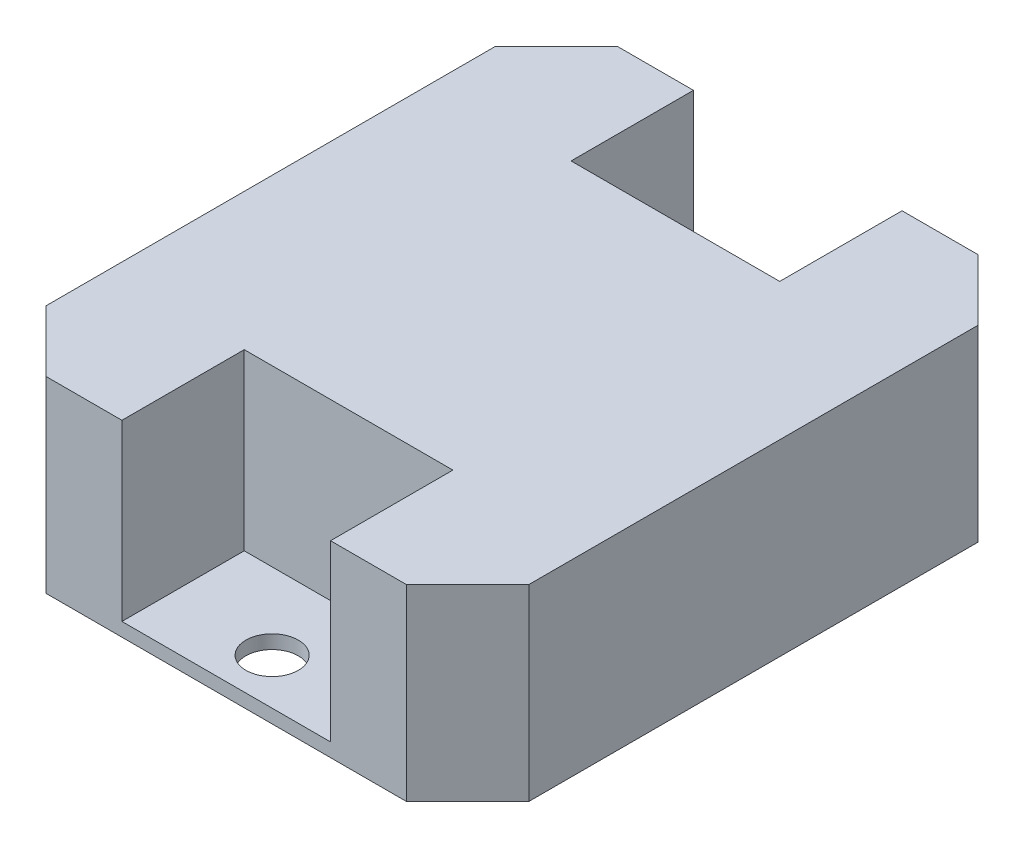
ISO-10303-21;
HEADER;
FILE_DESCRIPTION(('STEP AP214'),'2;1');
FILE_NAME('part.step','',(''),(''),'','','');
FILE_SCHEMA(('AUTOMOTIVE_DESIGN { 1 0 10303 214 1 1 1 1 }'));
ENDSEC;
DATA;
#1=APPLICATION_CONTEXT('core data for automotive mechanical design processes');
#2=APPLICATION_PROTOCOL_DEFINITION('international standard','automotive_design',2000,#1);
#3=PRODUCT_CONTEXT('',#1,'mechanical');
#4=PRODUCT('Part','Part','',(#3));
#5=PRODUCT_RELATED_PRODUCT_CATEGORY('part','',(#4));
#6=PRODUCT_DEFINITION_FORMATION('','',#4);
#7=PRODUCT_DEFINITION_CONTEXT('part definition',#1,'design');
#8=PRODUCT_DEFINITION('design','',#6,#7);
#9=PRODUCT_DEFINITION_SHAPE('','',#8);
#10=(LENGTH_UNIT() NAMED_UNIT(*) SI_UNIT(.MILLI.,.METRE.));
#11=(NAMED_UNIT(*) PLANE_ANGLE_UNIT() SI_UNIT($,.RADIAN.));
#12=(NAMED_UNIT(*) SI_UNIT($,.STERADIAN.) SOLID_ANGLE_UNIT());
#13=UNCERTAINTY_MEASURE_WITH_UNIT(LENGTH_MEASURE(1.E-05),#10,'distance_accuracy_value','');
#14=(GEOMETRIC_REPRESENTATION_CONTEXT(3) GLOBAL_UNCERTAINTY_ASSIGNED_CONTEXT((#13)) GLOBAL_UNIT_ASSIGNED_CONTEXT((#10,
#11,#12)) REPRESENTATION_CONTEXT('',''));
#15=CARTESIAN_POINT('',(0.,0.,0.));
#16=DIRECTION('',(0.,0.,1.));
#17=DIRECTION('',(1.,0.,0.));
#18=AXIS2_PLACEMENT_3D('',#15,#16,#17);
#19=CARTESIAN_POINT('',(-28.0650147607044,21.844,-33.2248770309455));
#20=DIRECTION('',(0.,-1.,0.));
#21=DIRECTION('',(0.,0.,-1.));
#22=AXIS2_PLACEMENT_3D('',#19,#20,#21);
#23=PLANE('',#22);
#24=DIRECTION('',(1.,0.,0.));
#25=VECTOR('',#24,1.);
#26=CARTESIAN_POINT('',(12.12651481081,21.844,-18.9991689074856));
#27=LINE('',#26,#25);
#28=CARTESIAN_POINT('',(-12.13048518919,21.844,-18.9991689074856));
#29=VERTEX_POINT('',#28);
#30=CARTESIAN_POINT('',(12.12651481081,21.844,-18.9991689074856));
#31=VERTEX_POINT('',#30);
#32=EDGE_CURVE('E157',#29,#31,#27,.T.);
#33=ORIENTED_EDGE('',*,*,#32,.F.);
#34=DIRECTION('',(0.,0.,1.));
#35=VECTOR('',#34,1.);
#36=CARTESIAN_POINT('',(-12.13048518919,21.844,-18.9991689074856));
#37=LINE('',#36,#35);
#38=CARTESIAN_POINT('',(-12.13048518919,21.844,-33.2239248934057));
#39=VERTEX_POINT('',#38);
#40=EDGE_CURVE('E164',#39,#29,#37,.T.);
#41=ORIENTED_EDGE('',*,*,#40,.F.);
#42=DIRECTION('',(-0.999999998214783,0.,-5.97530999417483E-05));
#43=VECTOR('',#42,1.);
#44=CARTESIAN_POINT('',(-20.9530147734008,21.844,-33.2244520668987));
#45=LINE('',#44,#43);
#46=CARTESIAN_POINT('',(-20.9530147734008,21.844,-33.2244520668987));
#47=VERTEX_POINT('',#46);
#48=EDGE_CURVE('E226',#39,#47,#45,.T.);
#49=ORIENTED_EDGE('',*,*,#48,.T.);
#50=DIRECTION('',(-0.707149031746375,0.,0.707064528102043));
#51=VECTOR('',#50,1.);
#52=CARTESIAN_POINT('',(-28.0654397247511,21.844,-26.1128770436419));
#53=LINE('',#52,#51);
#54=CARTESIAN_POINT('',(-28.0654397247511,21.844,-26.1128770436419));
#55=VERTEX_POINT('',#54);
#56=EDGE_CURVE('E228',#47,#55,#53,.T.);
#57=ORIENTED_EDGE('',*,*,#56,.T.);
#58=DIRECTION('',(-5.9753099941735E-05,0.,0.999999998214783));
#59=VECTOR('',#58,1.);
#60=CARTESIAN_POINT('',(-28.0685601750375,21.844,26.1095228631298));
#61=LINE('',#60,#59);
#62=CARTESIAN_POINT('',(-28.0685601750375,21.844,26.1095228631298));
#63=VERTEX_POINT('',#62);
#64=EDGE_CURVE('E210',#55,#63,#61,.T.);
#65=ORIENTED_EDGE('',*,*,#64,.T.);
#66=DIRECTION('',(0.707064528102043,0.,0.707149031746374));
#67=VECTOR('',#66,1.);
#68=CARTESIAN_POINT('',(-28.0685601750375,21.844,26.1095228631298));
#69=LINE('',#68,#67);
#70=CARTESIAN_POINT('',(-20.9569851517808,21.844,33.2219478144801));
#71=VERTEX_POINT('',#70);
#72=EDGE_CURVE('E213',#63,#71,#69,.T.);
#73=ORIENTED_EDGE('',*,*,#72,.T.);
#74=DIRECTION('',(0.999999998214783,0.,5.97530999417483E-05));
#75=VECTOR('',#74,1.);
#76=CARTESIAN_POINT('',(-20.9569851517808,21.844,33.2219478144801));
#77=LINE('',#76,#75);
#78=CARTESIAN_POINT('',(-12.13048518919,21.844,33.2224752252155));
#79=VERTEX_POINT('',#78);
#80=EDGE_CURVE('E217',#71,#79,#77,.T.);
#81=ORIENTED_EDGE('',*,*,#80,.T.);
#82=DIRECTION('',(0.,0.,1.));
#83=VECTOR('',#82,1.);
#84=CARTESIAN_POINT('',(-12.13048518919,21.844,33.4771999406894));
#85=LINE('',#84,#83);
#86=CARTESIAN_POINT('',(-12.13048518919,21.844,18.9991999406894));
#87=VERTEX_POINT('',#86);
#88=EDGE_CURVE('E57',#87,#79,#85,.T.);
#89=ORIENTED_EDGE('',*,*,#88,.F.);
#90=DIRECTION('',(-1.,0.,0.));
#91=VECTOR('',#90,1.);
#92=CARTESIAN_POINT('',(-12.13048518919,21.844,18.9991999406894));
#93=LINE('',#92,#91);
#94=CARTESIAN_POINT('',(12.12651481081,21.844,18.9991999406894));
#95=VERTEX_POINT('',#94);
#96=EDGE_CURVE('E180',#95,#87,#93,.T.);
#97=ORIENTED_EDGE('',*,*,#96,.F.);
#98=DIRECTION('',(0.,0.,-1.));
#99=VECTOR('',#98,1.);
#100=CARTESIAN_POINT('',(12.12651481081,21.844,33.4771999406894));
#101=LINE('',#100,#99);
#102=CARTESIAN_POINT('',(12.12651481081,21.844,33.2239246561633));
#103=VERTEX_POINT('',#102);
#104=EDGE_CURVE('E184',#103,#95,#101,.T.);
#105=ORIENTED_EDGE('',*,*,#104,.F.);
#106=CARTESIAN_POINT('',(20.9530147734008,21.844,33.2244520668987));
#107=VERTEX_POINT('',#106);
#108=EDGE_CURVE('E216',#103,#107,#77,.T.);
#109=ORIENTED_EDGE('',*,*,#108,.T.);
#110=DIRECTION('',(0.707149031746374,0.,-0.707064528102043));
#111=VECTOR('',#110,1.);
#112=CARTESIAN_POINT('',(20.9530147734008,21.844,33.2244520668987));
#113=LINE('',#112,#111);
#114=CARTESIAN_POINT('',(28.0654397247511,21.844,26.1128770436419));
#115=VERTEX_POINT('',#114);
#116=EDGE_CURVE('E220',#107,#115,#113,.T.);
#117=ORIENTED_EDGE('',*,*,#116,.T.);
#118=DIRECTION('',(5.97530999416686E-05,0.,-0.999999998214783));
#119=VECTOR('',#118,1.);
#120=CARTESIAN_POINT('',(28.0654397247511,21.844,26.1128770436419));
#121=LINE('',#120,#119);
#122=CARTESIAN_POINT('',(28.0685601750375,21.844,-26.1095228631298));
#123=VERTEX_POINT('',#122);
#124=EDGE_CURVE('E222',#115,#123,#121,.T.);
#125=ORIENTED_EDGE('',*,*,#124,.T.);
#126=DIRECTION('',(-0.707064528102043,0.,-0.707149031746375));
#127=VECTOR('',#126,1.);
#128=CARTESIAN_POINT('',(20.9569851517808,21.844,-33.2219478144801));
#129=LINE('',#128,#127);
#130=CARTESIAN_POINT('',(20.9569851517808,21.844,-33.2219478144801));
#131=VERTEX_POINT('',#130);
#132=EDGE_CURVE('E224',#123,#131,#129,.T.);
#133=ORIENTED_EDGE('',*,*,#132,.T.);
#134=CARTESIAN_POINT('',(12.12651481081,21.844,-33.2224754624579));
#135=VERTEX_POINT('',#134);
#136=EDGE_CURVE('E168',#131,#135,#45,.T.);
#137=ORIENTED_EDGE('',*,*,#136,.T.);
#138=DIRECTION('',(0.,0.,-1.));
#139=VECTOR('',#138,1.);
#140=CARTESIAN_POINT('',(12.12651481081,21.844,-18.9991689074856));
#141=LINE('',#140,#139);
#142=EDGE_CURVE('E49',#31,#135,#141,.T.);
#143=ORIENTED_EDGE('',*,*,#142,.F.);
#144=EDGE_LOOP('',(#33,#41,#49,#57,#65,#73,#81,#89,#97,#105,#109,#117,#125,#133,#137,#143));
#145=FACE_BOUND('',#144,.T.);
#146=ADVANCED_FACE('F34',(#145),#23,.F.);
#147=CARTESIAN_POINT('',(-28.0650147607044,0.,-33.2248770309455));
#148=DIRECTION('',(0.,-1.,0.));
#149=DIRECTION('',(0.,0.,-1.));
#150=AXIS2_PLACEMENT_3D('',#147,#148,#149);
#151=PLANE('',#150);
#152=CARTESIAN_POINT('',(0.00166646615488639,0.,-27.8891999502117));
#153=DIRECTION('',(0.,1.,0.));
#154=DIRECTION('',(0.,0.,1.));
#155=AXIS2_PLACEMENT_3D('',#152,#153,#154);
#156=CIRCLE('',#155,3.048);
#157=CARTESIAN_POINT('',(0.00166646615488639,0.,-24.8411999502118));
#158=VERTEX_POINT('',#157);
#159=EDGE_CURVE('E206',#158,#158,#156,.T.);
#160=ORIENTED_EDGE('',*,*,#159,.T.);
#161=EDGE_LOOP('',(#160));
#162=FACE_BOUND('',#161,.T.);
#163=DIRECTION('',(-5.9753099941735E-05,0.,0.999999998214783));
#164=VECTOR('',#163,1.);
#165=CARTESIAN_POINT('',(-28.0685601750375,0.,26.1095228631298));
#166=LINE('',#165,#164);
#167=CARTESIAN_POINT('',(-28.0654397247511,0.,-26.1128770436419));
#168=VERTEX_POINT('',#167);
#169=CARTESIAN_POINT('',(-28.0685601750375,0.,26.1095228631298));
#170=VERTEX_POINT('',#169);
#171=EDGE_CURVE('E209',#168,#170,#166,.T.);
#172=ORIENTED_EDGE('',*,*,#171,.F.);
#173=DIRECTION('',(-0.707149031746375,0.,0.707064528102043));
#174=VECTOR('',#173,1.);
#175=CARTESIAN_POINT('',(-28.0654397247511,0.,-26.1128770436419));
#176=LINE('',#175,#174);
#177=CARTESIAN_POINT('',(-20.9530147734008,0.,-33.2244520668987));
#178=VERTEX_POINT('',#177);
#179=EDGE_CURVE('E214',#178,#168,#176,.T.);
#180=ORIENTED_EDGE('',*,*,#179,.F.);
#181=DIRECTION('',(-0.999999998214783,0.,-5.97530999417483E-05));
#182=VECTOR('',#181,1.);
#183=CARTESIAN_POINT('',(-20.9530147734008,0.,-33.2244520668987));
#184=LINE('',#183,#182);
#185=CARTESIAN_POINT('',(20.9569851517808,0.,-33.2219478144801));
#186=VERTEX_POINT('',#185);
#187=EDGE_CURVE('E243',#186,#178,#184,.T.);
#188=ORIENTED_EDGE('',*,*,#187,.F.);
#189=DIRECTION('',(-0.707064528102043,0.,-0.707149031746375));
#190=VECTOR('',#189,1.);
#191=CARTESIAN_POINT('',(20.9569851517808,0.,-33.2219478144801));
#192=LINE('',#191,#190);
#193=CARTESIAN_POINT('',(28.0685601750375,0.,-26.1095228631298));
#194=VERTEX_POINT('',#193);
#195=EDGE_CURVE('E241',#194,#186,#192,.T.);
#196=ORIENTED_EDGE('',*,*,#195,.F.);
#197=DIRECTION('',(5.97530999416686E-05,0.,-0.999999998214783));
#198=VECTOR('',#197,1.);
#199=CARTESIAN_POINT('',(28.0654397247511,0.,26.1128770436419));
#200=LINE('',#199,#198);
#201=CARTESIAN_POINT('',(28.0654397247511,0.,26.1128770436419));
#202=VERTEX_POINT('',#201);
#203=EDGE_CURVE('E239',#202,#194,#200,.T.);
#204=ORIENTED_EDGE('',*,*,#203,.F.);
#205=DIRECTION('',(0.707149031746374,0.,-0.707064528102043));
#206=VECTOR('',#205,1.);
#207=CARTESIAN_POINT('',(20.9530147734008,0.,33.2244520668987));
#208=LINE('',#207,#206);
#209=CARTESIAN_POINT('',(20.9530147734008,0.,33.2244520668987));
#210=VERTEX_POINT('',#209);
#211=EDGE_CURVE('E237',#210,#202,#208,.T.);
#212=ORIENTED_EDGE('',*,*,#211,.F.);
#213=DIRECTION('',(0.999999998214783,0.,5.97530999417483E-05));
#214=VECTOR('',#213,1.);
#215=CARTESIAN_POINT('',(-20.9569851517808,0.,33.2219478144801));
#216=LINE('',#215,#214);
#217=CARTESIAN_POINT('',(-20.9569851517808,0.,33.2219478144801));
#218=VERTEX_POINT('',#217);
#219=EDGE_CURVE('E235',#218,#210,#216,.T.);
#220=ORIENTED_EDGE('',*,*,#219,.F.);
#221=DIRECTION('',(0.707064528102043,0.,0.707149031746374));
#222=VECTOR('',#221,1.);
#223=CARTESIAN_POINT('',(-28.0685601750375,0.,26.1095228631298));
#224=LINE('',#223,#222);
#225=EDGE_CURVE('E233',#170,#218,#224,.T.);
#226=ORIENTED_EDGE('',*,*,#225,.F.);
#227=EDGE_LOOP('',(#172,#180,#188,#196,#204,#212,#220,#226));
#228=FACE_BOUND('',#227,.T.);
#229=CARTESIAN_POINT('',(-0.00166646615490373,0.,27.8891999502117));
#230=DIRECTION('',(0.,1.,0.));
#231=DIRECTION('',(0.,0.,1.));
#232=AXIS2_PLACEMENT_3D('',#229,#230,#231);
#233=CIRCLE('',#232,3.04799999999999);
#234=CARTESIAN_POINT('',(-0.00166646615490373,0.,30.9371999502117));
#235=VERTEX_POINT('',#234);
#236=EDGE_CURVE('E203',#235,#235,#233,.T.);
#237=ORIENTED_EDGE('',*,*,#236,.T.);
#238=EDGE_LOOP('',(#237));
#239=FACE_BOUND('',#238,.T.);
#240=ADVANCED_FACE('F331',(#162,#228,#239),#151,.T.);
#241=CARTESIAN_POINT('',(-28.0685601750375,21.844,26.1095228631298));
#242=DIRECTION('',(0.999999998214783,0.,5.9753099941735E-05));
#243=DIRECTION('',(5.9753099941735E-05,0.,-0.999999998214784));
#244=AXIS2_PLACEMENT_3D('',#241,#242,#243);
#245=PLANE('',#244);
#246=ORIENTED_EDGE('',*,*,#171,.T.);
#247=DIRECTION('',(0.,-1.,0.));
#248=VECTOR('',#247,1.);
#249=CARTESIAN_POINT('',(-28.0685601750375,21.844,26.1095228631298));
#250=LINE('',#249,#248);
#251=EDGE_CURVE('E266',#63,#170,#250,.T.);
#252=ORIENTED_EDGE('',*,*,#251,.F.);
#253=ORIENTED_EDGE('',*,*,#64,.F.);
#254=DIRECTION('',(0.,-1.,0.));
#255=VECTOR('',#254,1.);
#256=CARTESIAN_POINT('',(-28.0654397247511,21.844,-26.1128770436419));
#257=LINE('',#256,#255);
#258=EDGE_CURVE('E230',#55,#168,#257,.T.);
#259=ORIENTED_EDGE('',*,*,#258,.T.);
#260=EDGE_LOOP('',(#246,#252,#253,#259));
#261=FACE_BOUND('',#260,.T.);
#262=ADVANCED_FACE('F36',(#261),#245,.F.);
#263=CARTESIAN_POINT('',(-28.0685601750375,21.844,26.1095228631298));
#264=DIRECTION('',(0.707149031746374,0.,-0.707064528102043));
#265=DIRECTION('',(-0.707064528102043,0.,-0.707149031746374));
#266=AXIS2_PLACEMENT_3D('',#263,#264,#265);
#267=PLANE('',#266);
#268=ORIENTED_EDGE('',*,*,#225,.T.);
#269=DIRECTION('',(0.,-1.,0.));
#270=VECTOR('',#269,1.);
#271=CARTESIAN_POINT('',(-20.9569851517808,21.844,33.2219478144801));
#272=LINE('',#271,#270);
#273=EDGE_CURVE('E263',#71,#218,#272,.T.);
#274=ORIENTED_EDGE('',*,*,#273,.F.);
#275=ORIENTED_EDGE('',*,*,#72,.F.);
#276=ORIENTED_EDGE('',*,*,#251,.T.);
#277=EDGE_LOOP('',(#268,#274,#275,#276));
#278=FACE_BOUND('',#277,.T.);
#279=ADVANCED_FACE('F298',(#278),#267,.F.);
#280=CARTESIAN_POINT('',(-20.9569851517808,21.844,33.2219478144801));
#281=DIRECTION('',(5.97530999417483E-05,0.,-0.999999998214783));
#282=DIRECTION('',(-0.999999998214784,0.,-5.97530999417484E-05));
#283=AXIS2_PLACEMENT_3D('',#280,#281,#282);
#284=PLANE('',#283);
#285=ORIENTED_EDGE('',*,*,#108,.F.);
#286=DIRECTION('',(0.,-1.,0.));
#287=VECTOR('',#286,1.);
#288=CARTESIAN_POINT('',(12.12651481081,21.844,33.2239246561633));
#289=LINE('',#288,#287);
#290=CARTESIAN_POINT('',(12.12651481081,1.5875,33.2239246561633));
#291=VERTEX_POINT('',#290);
#292=EDGE_CURVE('E273',#103,#291,#289,.T.);
#293=ORIENTED_EDGE('',*,*,#292,.T.);
#294=DIRECTION('',(-0.999999998214784,0.,-5.97530999417484E-05));
#295=VECTOR('',#294,1.);
#296=CARTESIAN_POINT('',(-20.9569851517808,1.5875,33.2219478144801));
#297=LINE('',#296,#295);
#298=CARTESIAN_POINT('',(-12.13048518919,1.5875,33.2224752252155));
#299=VERTEX_POINT('',#298);
#300=EDGE_CURVE('E200',#291,#299,#297,.T.);
#301=ORIENTED_EDGE('',*,*,#300,.T.);
#302=DIRECTION('',(0.,1.,0.));
#303=VECTOR('',#302,1.);
#304=CARTESIAN_POINT('',(-12.13048518919,21.844,33.2224752252155));
#305=LINE('',#304,#303);
#306=EDGE_CURVE('E269',#299,#79,#305,.T.);
#307=ORIENTED_EDGE('',*,*,#306,.T.);
#308=ORIENTED_EDGE('',*,*,#80,.F.);
#309=ORIENTED_EDGE('',*,*,#273,.T.);
#310=ORIENTED_EDGE('',*,*,#219,.T.);
#311=DIRECTION('',(0.,-1.,0.));
#312=VECTOR('',#311,1.);
#313=CARTESIAN_POINT('',(20.9530147734008,21.844,33.2244520668987));
#314=LINE('',#313,#312);
#315=EDGE_CURVE('E260',#107,#210,#314,.T.);
#316=ORIENTED_EDGE('',*,*,#315,.F.);
#317=EDGE_LOOP('',(#285,#293,#301,#307,#308,#309,#310,#316));
#318=FACE_BOUND('',#317,.T.);
#319=ADVANCED_FACE('F303',(#318),#284,.F.);
#320=CARTESIAN_POINT('',(20.9530147734008,21.844,33.2244520668987));
#321=DIRECTION('',(-0.707064528102043,0.,-0.707149031746374));
#322=DIRECTION('',(-0.707149031746374,0.,0.707064528102043));
#323=AXIS2_PLACEMENT_3D('',#320,#321,#322);
#324=PLANE('',#323);
#325=ORIENTED_EDGE('',*,*,#211,.T.);
#326=DIRECTION('',(0.,-1.,0.));
#327=VECTOR('',#326,1.);
#328=CARTESIAN_POINT('',(28.0654397247511,21.844,26.1128770436419));
#329=LINE('',#328,#327);
#330=EDGE_CURVE('E257',#115,#202,#329,.T.);
#331=ORIENTED_EDGE('',*,*,#330,.F.);
#332=ORIENTED_EDGE('',*,*,#116,.F.);
#333=ORIENTED_EDGE('',*,*,#315,.T.);
#334=EDGE_LOOP('',(#325,#331,#332,#333));
#335=FACE_BOUND('',#334,.T.);
#336=ADVANCED_FACE('F320',(#335),#324,.F.);
#337=CARTESIAN_POINT('',(28.0654397247511,21.844,26.1128770436419));
#338=DIRECTION('',(-0.999999998214783,0.,-5.97530999416686E-05));
#339=DIRECTION('',(-5.97530999416686E-05,0.,0.999999998214784));
#340=AXIS2_PLACEMENT_3D('',#337,#338,#339);
#341=PLANE('',#340);
#342=ORIENTED_EDGE('',*,*,#203,.T.);
#343=DIRECTION('',(0.,-1.,0.));
#344=VECTOR('',#343,1.);
#345=CARTESIAN_POINT('',(28.0685601750375,21.844,-26.1095228631298));
#346=LINE('',#345,#344);
#347=EDGE_CURVE('E254',#123,#194,#346,.T.);
#348=ORIENTED_EDGE('',*,*,#347,.F.);
#349=ORIENTED_EDGE('',*,*,#124,.F.);
#350=ORIENTED_EDGE('',*,*,#330,.T.);
#351=EDGE_LOOP('',(#342,#348,#349,#350));
#352=FACE_BOUND('',#351,.T.);
#353=ADVANCED_FACE('F324',(#352),#341,.F.);
#354=CARTESIAN_POINT('',(20.9569851517808,21.844,-33.2219478144801));
#355=DIRECTION('',(-0.707149031746375,0.,0.707064528102043));
#356=DIRECTION('',(0.707064528102043,0.,0.707149031746375));
#357=AXIS2_PLACEMENT_3D('',#354,#355,#356);
#358=PLANE('',#357);
#359=ORIENTED_EDGE('',*,*,#195,.T.);
#360=DIRECTION('',(0.,-1.,0.));
#361=VECTOR('',#360,1.);
#362=CARTESIAN_POINT('',(20.9569851517808,21.844,-33.2219478144801));
#363=LINE('',#362,#361);
#364=EDGE_CURVE('E251',#131,#186,#363,.T.);
#365=ORIENTED_EDGE('',*,*,#364,.F.);
#366=ORIENTED_EDGE('',*,*,#132,.F.);
#367=ORIENTED_EDGE('',*,*,#347,.T.);
#368=EDGE_LOOP('',(#359,#365,#366,#367));
#369=FACE_BOUND('',#368,.T.);
#370=ADVANCED_FACE('F329',(#369),#358,.F.);
#371=CARTESIAN_POINT('',(-20.9530147734008,21.844,-33.2244520668987));
#372=DIRECTION('',(-5.97530999417483E-05,0.,0.999999998214783));
#373=DIRECTION('',(0.999999998214784,0.,5.97530999417484E-05));
#374=AXIS2_PLACEMENT_3D('',#371,#372,#373);
#375=PLANE('',#374);
#376=ORIENTED_EDGE('',*,*,#48,.F.);
#377=DIRECTION('',(0.,-1.,0.));
#378=VECTOR('',#377,1.);
#379=CARTESIAN_POINT('',(-12.13048518919,21.844,-33.2239248934057));
#380=LINE('',#379,#378);
#381=CARTESIAN_POINT('',(-12.13048518919,1.5875,-33.2239248934057));
#382=VERTEX_POINT('',#381);
#383=EDGE_CURVE('E12',#39,#382,#380,.T.);
#384=ORIENTED_EDGE('',*,*,#383,.T.);
#385=DIRECTION('',(0.999999998214784,0.,5.97530999417484E-05));
#386=VECTOR('',#385,1.);
#387=CARTESIAN_POINT('',(-20.9530147734008,1.5875,-33.2244520668987));
#388=LINE('',#387,#386);
#389=CARTESIAN_POINT('',(12.12651481081,1.5875,-33.2224754624579));
#390=VERTEX_POINT('',#389);
#391=EDGE_CURVE('E177',#382,#390,#388,.T.);
#392=ORIENTED_EDGE('',*,*,#391,.T.);
#393=DIRECTION('',(0.,1.,0.));
#394=VECTOR('',#393,1.);
#395=CARTESIAN_POINT('',(12.12651481081,21.844,-33.2224754624579));
#396=LINE('',#395,#394);
#397=EDGE_CURVE('E42',#390,#135,#396,.T.);
#398=ORIENTED_EDGE('',*,*,#397,.T.);
#399=ORIENTED_EDGE('',*,*,#136,.F.);
#400=ORIENTED_EDGE('',*,*,#364,.T.);
#401=ORIENTED_EDGE('',*,*,#187,.T.);
#402=DIRECTION('',(0.,-1.,0.));
#403=VECTOR('',#402,1.);
#404=CARTESIAN_POINT('',(-20.9530147734008,21.844,-33.2244520668987));
#405=LINE('',#404,#403);
#406=EDGE_CURVE('E248',#47,#178,#405,.T.);
#407=ORIENTED_EDGE('',*,*,#406,.F.);
#408=EDGE_LOOP('',(#376,#384,#392,#398,#399,#400,#401,#407));
#409=FACE_BOUND('',#408,.T.);
#410=ADVANCED_FACE('F279',(#409),#375,.F.);
#411=CARTESIAN_POINT('',(-28.0654397247511,21.844,-26.1128770436419));
#412=DIRECTION('',(0.707064528102043,0.,0.707149031746375));
#413=DIRECTION('',(0.707149031746375,0.,-0.707064528102043));
#414=AXIS2_PLACEMENT_3D('',#411,#412,#413);
#415=PLANE('',#414);
#416=ORIENTED_EDGE('',*,*,#179,.T.);
#417=ORIENTED_EDGE('',*,*,#258,.F.);
#418=ORIENTED_EDGE('',*,*,#56,.F.);
#419=ORIENTED_EDGE('',*,*,#406,.T.);
#420=EDGE_LOOP('',(#416,#417,#418,#419));
#421=FACE_BOUND('',#420,.T.);
#422=ADVANCED_FACE('F291',(#421),#415,.F.);
#423=CARTESIAN_POINT('',(0.00166646615488639,21.844,-27.8891999502117));
#424=DIRECTION('',(0.,-1.,0.));
#425=DIRECTION('',(0.,0.,-1.));
#426=AXIS2_PLACEMENT_3D('',#423,#424,#425);
#427=CYLINDRICAL_SURFACE('',#426,3.048);
#428=CARTESIAN_POINT('',(0.00166646615488639,1.5875,-27.8891999502117));
#429=DIRECTION('',(0.,-1.,0.));
#430=DIRECTION('',(0.,0.,-1.));
#431=AXIS2_PLACEMENT_3D('',#428,#429,#430);
#432=CIRCLE('',#431,3.048);
#433=CARTESIAN_POINT('',(0.00166646615488639,1.5875,-30.9371999502117));
#434=VERTEX_POINT('',#433);
#435=EDGE_CURVE('E173',#434,#434,#432,.T.);
#436=ORIENTED_EDGE('',*,*,#435,.F.);
#437=EDGE_LOOP('',(#436));
#438=FACE_BOUND('',#437,.T.);
#439=ORIENTED_EDGE('',*,*,#159,.F.);
#440=EDGE_LOOP('',(#439));
#441=FACE_BOUND('',#440,.T.);
#442=ADVANCED_FACE('F340',(#438,#441),#427,.F.);
#443=CARTESIAN_POINT('',(-0.00166646615490373,21.844,27.8891999502117));
#444=DIRECTION('',(0.,-1.,0.));
#445=DIRECTION('',(0.,0.,-1.));
#446=AXIS2_PLACEMENT_3D('',#443,#444,#445);
#447=CYLINDRICAL_SURFACE('',#446,3.04799999999999);
#448=CARTESIAN_POINT('',(-0.00166646615490373,1.5875,27.8891999502117));
#449=DIRECTION('',(0.,-1.,0.));
#450=DIRECTION('',(0.,0.,-1.));
#451=AXIS2_PLACEMENT_3D('',#448,#449,#450);
#452=CIRCLE('',#451,3.04799999999999);
#453=CARTESIAN_POINT('',(-0.00166646615490373,1.5875,24.8411999502118));
#454=VERTEX_POINT('',#453);
#455=EDGE_CURVE('E190',#454,#454,#452,.T.);
#456=ORIENTED_EDGE('',*,*,#455,.F.);
#457=EDGE_LOOP('',(#456));
#458=FACE_BOUND('',#457,.T.);
#459=ORIENTED_EDGE('',*,*,#236,.F.);
#460=EDGE_LOOP('',(#459));
#461=FACE_BOUND('',#460,.T.);
#462=ADVANCED_FACE('F338',(#458,#461),#447,.F.);
#463=CARTESIAN_POINT('',(12.12651481081,-28.2491510137915,33.4771999406894));
#464=DIRECTION('',(1.,0.,0.));
#465=DIRECTION('',(0.,0.,-1.));
#466=AXIS2_PLACEMENT_3D('',#463,#464,#465);
#467=PLANE('',#466);
#468=ORIENTED_EDGE('',*,*,#104,.T.);
#469=DIRECTION('',(0.,1.,0.));
#470=VECTOR('',#469,1.);
#471=CARTESIAN_POINT('',(12.12651481081,-28.2491510137915,18.9991999406894));
#472=LINE('',#471,#470);
#473=CARTESIAN_POINT('',(12.12651481081,1.5875,18.9991999406894));
#474=VERTEX_POINT('',#473);
#475=EDGE_CURVE('E195',#474,#95,#472,.T.);
#476=ORIENTED_EDGE('',*,*,#475,.F.);
#477=DIRECTION('',(0.,0.,-1.));
#478=VECTOR('',#477,1.);
#479=CARTESIAN_POINT('',(12.12651481081,1.5875,33.4771999406894));
#480=LINE('',#479,#478);
#481=EDGE_CURVE('E183',#291,#474,#480,.T.);
#482=ORIENTED_EDGE('',*,*,#481,.F.);
#483=ORIENTED_EDGE('',*,*,#292,.F.);
#484=EDGE_LOOP('',(#468,#476,#482,#483));
#485=FACE_BOUND('',#484,.T.);
#486=ADVANCED_FACE('F313',(#485),#467,.F.);
#487=CARTESIAN_POINT('',(-12.13048518919,-28.2491510137915,33.4771999406894));
#488=DIRECTION('',(-1.,0.,0.));
#489=DIRECTION('',(0.,0.,1.));
#490=AXIS2_PLACEMENT_3D('',#487,#488,#489);
#491=PLANE('',#490);
#492=DIRECTION('',(0.,0.,1.));
#493=VECTOR('',#492,1.);
#494=CARTESIAN_POINT('',(-12.13048518919,1.5875,33.4771999406894));
#495=LINE('',#494,#493);
#496=CARTESIAN_POINT('',(-12.13048518919,1.5875,18.9991999406894));
#497=VERTEX_POINT('',#496);
#498=EDGE_CURVE('E187',#497,#299,#495,.T.);
#499=ORIENTED_EDGE('',*,*,#498,.F.);
#500=DIRECTION('',(0.,1.,0.));
#501=VECTOR('',#500,1.);
#502=CARTESIAN_POINT('',(-12.13048518919,-28.2491510137915,18.9991999406894));
#503=LINE('',#502,#501);
#504=EDGE_CURVE('E191',#497,#87,#503,.T.);
#505=ORIENTED_EDGE('',*,*,#504,.T.);
#506=ORIENTED_EDGE('',*,*,#88,.T.);
#507=ORIENTED_EDGE('',*,*,#306,.F.);
#508=EDGE_LOOP('',(#499,#505,#506,#507));
#509=FACE_BOUND('',#508,.T.);
#510=ADVANCED_FACE('F347',(#509),#491,.F.);
#511=CARTESIAN_POINT('',(-28.0650147607044,1.5875,-33.2248770309455));
#512=DIRECTION('',(0.,-1.,0.));
#513=DIRECTION('',(0.,0.,-1.));
#514=AXIS2_PLACEMENT_3D('',#511,#512,#513);
#515=PLANE('',#514);
#516=ORIENTED_EDGE('',*,*,#455,.T.);
#517=EDGE_LOOP('',(#516));
#518=FACE_BOUND('',#517,.T.);
#519=ORIENTED_EDGE('',*,*,#481,.T.);
#520=DIRECTION('',(-1.,0.,0.));
#521=VECTOR('',#520,1.);
#522=CARTESIAN_POINT('',(-12.13048518919,1.5875,18.9991999406894));
#523=LINE('',#522,#521);
#524=EDGE_CURVE('E192',#474,#497,#523,.T.);
#525=ORIENTED_EDGE('',*,*,#524,.T.);
#526=ORIENTED_EDGE('',*,*,#498,.T.);
#527=ORIENTED_EDGE('',*,*,#300,.F.);
#528=EDGE_LOOP('',(#519,#525,#526,#527));
#529=FACE_BOUND('',#528,.T.);
#530=ADVANCED_FACE('F442',(#518,#529),#515,.F.);
#531=CARTESIAN_POINT('',(-12.13048518919,-28.2491510137915,18.9991999406894));
#532=DIRECTION('',(0.,0.,-1.));
#533=DIRECTION('',(-1.,0.,0.));
#534=AXIS2_PLACEMENT_3D('',#531,#532,#533);
#535=PLANE('',#534);
#536=ORIENTED_EDGE('',*,*,#475,.T.);
#537=ORIENTED_EDGE('',*,*,#96,.T.);
#538=ORIENTED_EDGE('',*,*,#504,.F.);
#539=ORIENTED_EDGE('',*,*,#524,.F.);
#540=EDGE_LOOP('',(#536,#537,#538,#539));
#541=FACE_BOUND('',#540,.T.);
#542=ADVANCED_FACE('F308',(#541),#535,.F.);
#543=CARTESIAN_POINT('',(-12.13048518919,-28.2491510137915,-18.9991689074856));
#544=DIRECTION('',(-1.,0.,0.));
#545=DIRECTION('',(0.,0.,1.));
#546=AXIS2_PLACEMENT_3D('',#543,#544,#545);
#547=PLANE('',#546);
#548=ORIENTED_EDGE('',*,*,#40,.T.);
#549=DIRECTION('',(0.,1.,0.));
#550=VECTOR('',#549,1.);
#551=CARTESIAN_POINT('',(-12.13048518919,-28.2491510137915,-18.9991689074856));
#552=LINE('',#551,#550);
#553=CARTESIAN_POINT('',(-12.13048518919,1.5875,-18.9991689074856));
#554=VERTEX_POINT('',#553);
#555=EDGE_CURVE('E160',#554,#29,#552,.T.);
#556=ORIENTED_EDGE('',*,*,#555,.F.);
#557=DIRECTION('',(0.,0.,1.));
#558=VECTOR('',#557,1.);
#559=CARTESIAN_POINT('',(-12.13048518919,1.5875,-18.9991689074856));
#560=LINE('',#559,#558);
#561=EDGE_CURVE('E163',#382,#554,#560,.T.);
#562=ORIENTED_EDGE('',*,*,#561,.F.);
#563=ORIENTED_EDGE('',*,*,#383,.F.);
#564=EDGE_LOOP('',(#548,#556,#562,#563));
#565=FACE_BOUND('',#564,.T.);
#566=ADVANCED_FACE('F284',(#565),#547,.F.);
#567=CARTESIAN_POINT('',(12.12651481081,-28.2491510137915,-18.9991689074856));
#568=DIRECTION('',(1.,0.,0.));
#569=DIRECTION('',(0.,0.,-1.));
#570=AXIS2_PLACEMENT_3D('',#567,#568,#569);
#571=PLANE('',#570);
#572=DIRECTION('',(0.,0.,-1.));
#573=VECTOR('',#572,1.);
#574=CARTESIAN_POINT('',(12.12651481081,1.5875,-18.9991689074856));
#575=LINE('',#574,#573);
#576=CARTESIAN_POINT('',(12.12651481081,1.5875,-18.9991689074856));
#577=VERTEX_POINT('',#576);
#578=EDGE_CURVE('E149',#577,#390,#575,.T.);
#579=ORIENTED_EDGE('',*,*,#578,.F.);
#580=DIRECTION('',(0.,1.,0.));
#581=VECTOR('',#580,1.);
#582=CARTESIAN_POINT('',(12.12651481081,-28.2491510137915,-18.9991689074856));
#583=LINE('',#582,#581);
#584=EDGE_CURVE('E145',#577,#31,#583,.T.);
#585=ORIENTED_EDGE('',*,*,#584,.T.);
#586=ORIENTED_EDGE('',*,*,#142,.T.);
#587=ORIENTED_EDGE('',*,*,#397,.F.);
#588=EDGE_LOOP('',(#579,#585,#586,#587));
#589=FACE_BOUND('',#588,.T.);
#590=ADVANCED_FACE('F147',(#589),#571,.F.);
#591=CARTESIAN_POINT('',(-28.0650147607044,1.5875,-33.2248770309455));
#592=DIRECTION('',(0.,-1.,0.));
#593=DIRECTION('',(0.,0.,-1.));
#594=AXIS2_PLACEMENT_3D('',#591,#592,#593);
#595=PLANE('',#594);
#596=ORIENTED_EDGE('',*,*,#435,.T.);
#597=EDGE_LOOP('',(#596));
#598=FACE_BOUND('',#597,.T.);
#599=ORIENTED_EDGE('',*,*,#561,.T.);
#600=DIRECTION('',(1.,0.,0.));
#601=VECTOR('',#600,1.);
#602=CARTESIAN_POINT('',(12.12651481081,1.5875,-18.9991689074856));
#603=LINE('',#602,#601);
#604=EDGE_CURVE('E153',#554,#577,#603,.T.);
#605=ORIENTED_EDGE('',*,*,#604,.T.);
#606=ORIENTED_EDGE('',*,*,#578,.T.);
#607=ORIENTED_EDGE('',*,*,#391,.F.);
#608=EDGE_LOOP('',(#599,#605,#606,#607));
#609=FACE_BOUND('',#608,.T.);
#610=ADVANCED_FACE('F281',(#598,#609),#595,.F.);
#611=CARTESIAN_POINT('',(12.12651481081,-28.2491510137915,-18.9991689074856));
#612=DIRECTION('',(0.,0.,1.));
#613=DIRECTION('',(1.,0.,0.));
#614=AXIS2_PLACEMENT_3D('',#611,#612,#613);
#615=PLANE('',#614);
#616=ORIENTED_EDGE('',*,*,#555,.T.);
#617=ORIENTED_EDGE('',*,*,#32,.T.);
#618=ORIENTED_EDGE('',*,*,#584,.F.);
#619=ORIENTED_EDGE('',*,*,#604,.F.);
#620=EDGE_LOOP('',(#616,#617,#618,#619));
#621=FACE_BOUND('',#620,.T.);
#622=ADVANCED_FACE('F158',(#621),#615,.F.);
#623=CLOSED_SHELL('',(#146,#240,#262,#279,#319,#336,#353,#370,#410,#422,#442,#462,#486,#510,
#530,#542,#566,#590,#610,#622));
#624=MANIFOLD_SOLID_BREP('B2',#623);
#625=ADVANCED_BREP_SHAPE_REPRESENTATION('',(#18,#624),#14);
#626=SHAPE_DEFINITION_REPRESENTATION(#9,#625);
ENDSEC;
END-ISO-10303-21;
